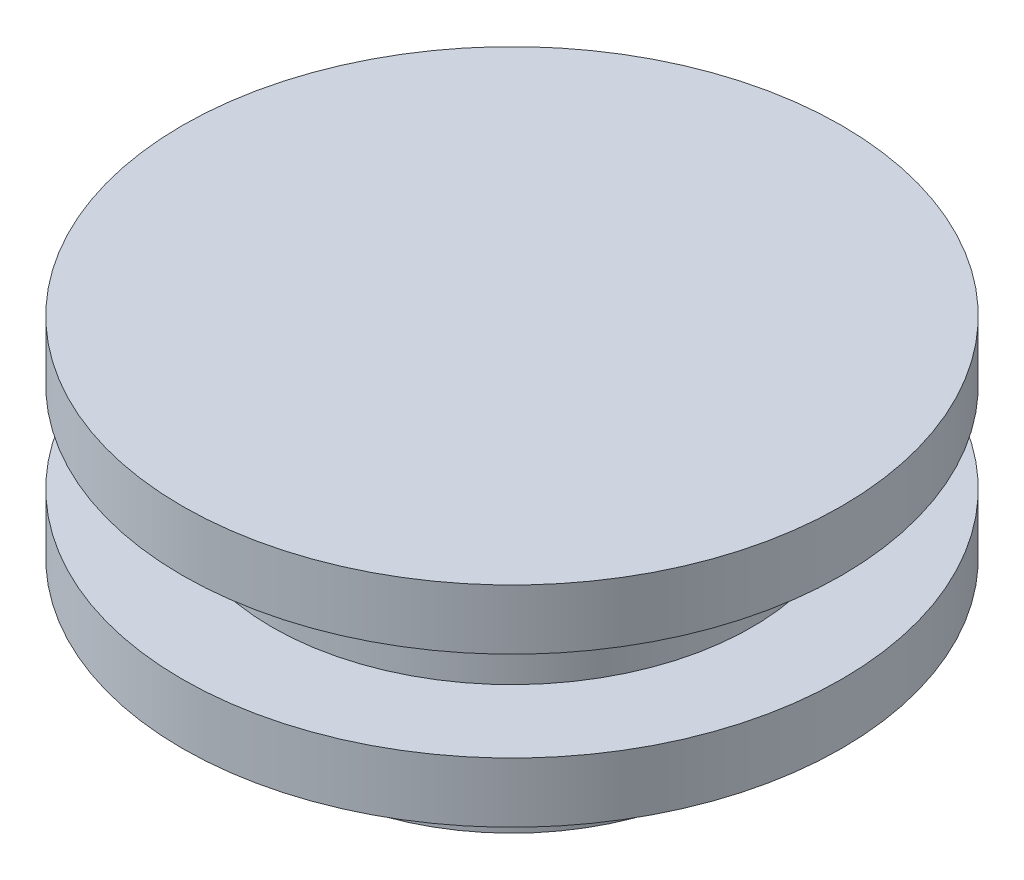
ISO-10303-21;
HEADER;
FILE_DESCRIPTION(('STEP AP214'),'2;1');
FILE_NAME('part.step','',(''),(''),'','','');
FILE_SCHEMA(('AUTOMOTIVE_DESIGN { 1 0 10303 214 1 1 1 1 }'));
ENDSEC;
DATA;
#1=APPLICATION_CONTEXT('core data for automotive mechanical design processes');
#2=APPLICATION_PROTOCOL_DEFINITION('international standard','automotive_design',2000,#1);
#3=PRODUCT_CONTEXT('',#1,'mechanical');
#4=PRODUCT('Part','Part','',(#3));
#5=PRODUCT_RELATED_PRODUCT_CATEGORY('part','',(#4));
#6=PRODUCT_DEFINITION_FORMATION('','',#4);
#7=PRODUCT_DEFINITION_CONTEXT('part definition',#1,'design');
#8=PRODUCT_DEFINITION('design','',#6,#7);
#9=PRODUCT_DEFINITION_SHAPE('','',#8);
#10=(LENGTH_UNIT() NAMED_UNIT(*) SI_UNIT(.MILLI.,.METRE.));
#11=(NAMED_UNIT(*) PLANE_ANGLE_UNIT() SI_UNIT($,.RADIAN.));
#12=(NAMED_UNIT(*) SI_UNIT($,.STERADIAN.) SOLID_ANGLE_UNIT());
#13=UNCERTAINTY_MEASURE_WITH_UNIT(LENGTH_MEASURE(1.E-05),#10,'distance_accuracy_value','');
#14=(GEOMETRIC_REPRESENTATION_CONTEXT(3) GLOBAL_UNCERTAINTY_ASSIGNED_CONTEXT((#13)) GLOBAL_UNIT_ASSIGNED_CONTEXT((#10,
#11,#12)) REPRESENTATION_CONTEXT('',''));
#15=CARTESIAN_POINT('',(0.,0.,0.));
#16=DIRECTION('',(0.,0.,1.));
#17=DIRECTION('',(1.,0.,0.));
#18=AXIS2_PLACEMENT_3D('',#15,#16,#17);
#19=CARTESIAN_POINT('',(3.5,-4.,0.));
#20=DIRECTION('',(0.,1.,0.));
#21=DIRECTION('',(0.,0.,1.));
#22=AXIS2_PLACEMENT_3D('',#19,#20,#21);
#23=PLANE('',#22);
#24=CARTESIAN_POINT('',(0.,-4.,0.));
#25=DIRECTION('',(0.,1.,0.));
#26=DIRECTION('',(0.,0.,1.));
#27=AXIS2_PLACEMENT_3D('',#24,#25,#26);
#28=CIRCLE('',#27,3.5);
#29=CARTESIAN_POINT('',(0.,-4.,3.5));
#30=VERTEX_POINT('',#29);
#31=EDGE_CURVE('E86',#30,#30,#28,.T.);
#32=ORIENTED_EDGE('',*,*,#31,.F.);
#33=EDGE_LOOP('',(#32));
#34=FACE_BOUND('',#33,.T.);
#35=CARTESIAN_POINT('',(0.,-4.,0.));
#36=DIRECTION('',(0.,1.,0.));
#37=DIRECTION('',(0.,0.,1.));
#38=AXIS2_PLACEMENT_3D('',#35,#36,#37);
#39=CIRCLE('',#38,2.5);
#40=CARTESIAN_POINT('',(0.,-4.,2.5));
#41=VERTEX_POINT('',#40);
#42=EDGE_CURVE('E10',#41,#41,#39,.T.);
#43=ORIENTED_EDGE('',*,*,#42,.T.);
#44=EDGE_LOOP('',(#43));
#45=FACE_BOUND('',#44,.T.);
#46=ADVANCED_FACE('F43',(#34,#45),#23,.F.);
#47=CARTESIAN_POINT('',(0.,5.1119654012494,0.));
#48=DIRECTION('',(0.,1.,0.));
#49=DIRECTION('',(0.,0.,1.));
#50=AXIS2_PLACEMENT_3D('',#47,#48,#49);
#51=CYLINDRICAL_SURFACE('',#50,2.5);
#52=ORIENTED_EDGE('',*,*,#42,.F.);
#53=EDGE_LOOP('',(#52));
#54=FACE_BOUND('',#53,.T.);
#55=CARTESIAN_POINT('',(0.,-0.999999999999999,0.));
#56=DIRECTION('',(0.,1.,0.));
#57=DIRECTION('',(0.,0.,1.));
#58=AXIS2_PLACEMENT_3D('',#55,#56,#57);
#59=CIRCLE('',#58,2.5);
#60=CARTESIAN_POINT('',(0.,-0.999999999999999,2.5));
#61=VERTEX_POINT('',#60);
#62=EDGE_CURVE('E50',#61,#61,#59,.T.);
#63=ORIENTED_EDGE('',*,*,#62,.T.);
#64=EDGE_LOOP('',(#63));
#65=FACE_BOUND('',#64,.T.);
#66=ADVANCED_FACE('F94',(#54,#65),#51,.F.);
#67=CARTESIAN_POINT('',(2.5,-1.,0.));
#68=DIRECTION('',(0.,1.,0.));
#69=DIRECTION('',(0.,0.,1.));
#70=AXIS2_PLACEMENT_3D('',#67,#68,#69);
#71=PLANE('',#70);
#72=ORIENTED_EDGE('',*,*,#62,.F.);
#73=EDGE_LOOP('',(#72));
#74=FACE_BOUND('',#73,.T.);
#75=ADVANCED_FACE('F98',(#74),#71,.F.);
#76=CARTESIAN_POINT('',(5.5,1.,0.));
#77=DIRECTION('',(0.,-1.,0.));
#78=DIRECTION('',(0.,0.,-1.));
#79=AXIS2_PLACEMENT_3D('',#76,#77,#78);
#80=PLANE('',#79);
#81=CARTESIAN_POINT('',(0.,1.,0.));
#82=DIRECTION('',(0.,1.,0.));
#83=DIRECTION('',(0.,0.,1.));
#84=AXIS2_PLACEMENT_3D('',#81,#82,#83);
#85=CIRCLE('',#84,5.5);
#86=CARTESIAN_POINT('',(0.,1.,5.5));
#87=VERTEX_POINT('',#86);
#88=EDGE_CURVE('E55',#87,#87,#85,.T.);
#89=ORIENTED_EDGE('',*,*,#88,.T.);
#90=EDGE_LOOP('',(#89));
#91=FACE_BOUND('',#90,.T.);
#92=ADVANCED_FACE('F103',(#91),#80,.F.);
#93=CARTESIAN_POINT('',(0.,5.1119654012494,0.));
#94=DIRECTION('',(0.,1.,0.));
#95=DIRECTION('',(0.,0.,1.));
#96=AXIS2_PLACEMENT_3D('',#93,#94,#95);
#97=CYLINDRICAL_SURFACE('',#96,5.5);
#98=ORIENTED_EDGE('',*,*,#88,.F.);
#99=EDGE_LOOP('',(#98));
#100=FACE_BOUND('',#99,.T.);
#101=CARTESIAN_POINT('',(0.,0.,0.));
#102=DIRECTION('',(0.,1.,0.));
#103=DIRECTION('',(0.,0.,1.));
#104=AXIS2_PLACEMENT_3D('',#101,#102,#103);
#105=CIRCLE('',#104,5.5);
#106=CARTESIAN_POINT('',(0.,0.,5.5));
#107=VERTEX_POINT('',#106);
#108=EDGE_CURVE('E60',#107,#107,#105,.T.);
#109=ORIENTED_EDGE('',*,*,#108,.T.);
#110=EDGE_LOOP('',(#109));
#111=FACE_BOUND('',#110,.T.);
#112=ADVANCED_FACE('F109',(#100,#111),#97,.T.);
#113=CARTESIAN_POINT('',(4.,0.,0.));
#114=DIRECTION('',(0.,1.,0.));
#115=DIRECTION('',(0.,0.,1.));
#116=AXIS2_PLACEMENT_3D('',#113,#114,#115);
#117=PLANE('',#116);
#118=ORIENTED_EDGE('',*,*,#108,.F.);
#119=EDGE_LOOP('',(#118));
#120=FACE_BOUND('',#119,.T.);
#121=CARTESIAN_POINT('',(0.,0.,0.));
#122=DIRECTION('',(0.,1.,0.));
#123=DIRECTION('',(0.,0.,1.));
#124=AXIS2_PLACEMENT_3D('',#121,#122,#123);
#125=CIRCLE('',#124,4.);
#126=CARTESIAN_POINT('',(0.,0.,4.));
#127=VERTEX_POINT('',#126);
#128=EDGE_CURVE('E66',#127,#127,#125,.T.);
#129=ORIENTED_EDGE('',*,*,#128,.T.);
#130=EDGE_LOOP('',(#129));
#131=FACE_BOUND('',#130,.T.);
#132=ADVANCED_FACE('F113',(#120,#131),#117,.F.);
#133=CARTESIAN_POINT('',(0.,5.1119654012494,0.));
#134=DIRECTION('',(0.,1.,0.));
#135=DIRECTION('',(0.,0.,1.));
#136=AXIS2_PLACEMENT_3D('',#133,#134,#135);
#137=CYLINDRICAL_SURFACE('',#136,4.);
#138=ORIENTED_EDGE('',*,*,#128,.F.);
#139=EDGE_LOOP('',(#138));
#140=FACE_BOUND('',#139,.T.);
#141=CARTESIAN_POINT('',(0.,-1.5,0.));
#142=DIRECTION('',(0.,1.,0.));
#143=DIRECTION('',(0.,0.,1.));
#144=AXIS2_PLACEMENT_3D('',#141,#142,#143);
#145=CIRCLE('',#144,4.);
#146=CARTESIAN_POINT('',(0.,-1.5,4.));
#147=VERTEX_POINT('',#146);
#148=EDGE_CURVE('E70',#147,#147,#145,.T.);
#149=ORIENTED_EDGE('',*,*,#148,.T.);
#150=EDGE_LOOP('',(#149));
#151=FACE_BOUND('',#150,.T.);
#152=ADVANCED_FACE('F117',(#140,#151),#137,.T.);
#153=CARTESIAN_POINT('',(5.5,-1.5,0.));
#154=DIRECTION('',(0.,-1.,0.));
#155=DIRECTION('',(0.,0.,-1.));
#156=AXIS2_PLACEMENT_3D('',#153,#154,#155);
#157=PLANE('',#156);
#158=ORIENTED_EDGE('',*,*,#148,.F.);
#159=EDGE_LOOP('',(#158));
#160=FACE_BOUND('',#159,.T.);
#161=CARTESIAN_POINT('',(0.,-1.5,0.));
#162=DIRECTION('',(0.,1.,0.));
#163=DIRECTION('',(0.,0.,1.));
#164=AXIS2_PLACEMENT_3D('',#161,#162,#163);
#165=CIRCLE('',#164,5.5);
#166=CARTESIAN_POINT('',(0.,-1.5,5.5));
#167=VERTEX_POINT('',#166);
#168=EDGE_CURVE('E74',#167,#167,#165,.T.);
#169=ORIENTED_EDGE('',*,*,#168,.T.);
#170=EDGE_LOOP('',(#169));
#171=FACE_BOUND('',#170,.T.);
#172=ADVANCED_FACE('F121',(#160,#171),#157,.F.);
#173=CARTESIAN_POINT('',(0.,5.1119654012494,0.));
#174=DIRECTION('',(0.,1.,0.));
#175=DIRECTION('',(0.,0.,1.));
#176=AXIS2_PLACEMENT_3D('',#173,#174,#175);
#177=CYLINDRICAL_SURFACE('',#176,5.5);
#178=ORIENTED_EDGE('',*,*,#168,.F.);
#179=EDGE_LOOP('',(#178));
#180=FACE_BOUND('',#179,.T.);
#181=CARTESIAN_POINT('',(0.,-2.5,0.));
#182=DIRECTION('',(0.,1.,0.));
#183=DIRECTION('',(0.,0.,1.));
#184=AXIS2_PLACEMENT_3D('',#181,#182,#183);
#185=CIRCLE('',#184,5.5);
#186=CARTESIAN_POINT('',(0.,-2.5,5.5));
#187=VERTEX_POINT('',#186);
#188=EDGE_CURVE('E78',#187,#187,#185,.T.);
#189=ORIENTED_EDGE('',*,*,#188,.T.);
#190=EDGE_LOOP('',(#189));
#191=FACE_BOUND('',#190,.T.);
#192=ADVANCED_FACE('F125',(#180,#191),#177,.T.);
#193=CARTESIAN_POINT('',(3.5,-2.5,0.));
#194=DIRECTION('',(0.,1.,0.));
#195=DIRECTION('',(0.,0.,1.));
#196=AXIS2_PLACEMENT_3D('',#193,#194,#195);
#197=PLANE('',#196);
#198=ORIENTED_EDGE('',*,*,#188,.F.);
#199=EDGE_LOOP('',(#198));
#200=FACE_BOUND('',#199,.T.);
#201=CARTESIAN_POINT('',(0.,-2.5,0.));
#202=DIRECTION('',(0.,1.,0.));
#203=DIRECTION('',(0.,0.,1.));
#204=AXIS2_PLACEMENT_3D('',#201,#202,#203);
#205=CIRCLE('',#204,3.5);
#206=CARTESIAN_POINT('',(0.,-2.5,3.5));
#207=VERTEX_POINT('',#206);
#208=EDGE_CURVE('E82',#207,#207,#205,.T.);
#209=ORIENTED_EDGE('',*,*,#208,.T.);
#210=EDGE_LOOP('',(#209));
#211=FACE_BOUND('',#210,.T.);
#212=ADVANCED_FACE('F129',(#200,#211),#197,.F.);
#213=CARTESIAN_POINT('',(0.,5.1119654012494,0.));
#214=DIRECTION('',(0.,1.,0.));
#215=DIRECTION('',(0.,0.,1.));
#216=AXIS2_PLACEMENT_3D('',#213,#214,#215);
#217=CYLINDRICAL_SURFACE('',#216,3.5);
#218=ORIENTED_EDGE('',*,*,#208,.F.);
#219=EDGE_LOOP('',(#218));
#220=FACE_BOUND('',#219,.T.);
#221=ORIENTED_EDGE('',*,*,#31,.T.);
#222=EDGE_LOOP('',(#221));
#223=FACE_BOUND('',#222,.T.);
#224=ADVANCED_FACE('F91',(#220,#223),#217,.T.);
#225=CLOSED_SHELL('',(#46,#66,#75,#92,#112,#132,#152,#172,#192,#212,#224));
#226=MANIFOLD_SOLID_BREP('B2',#225);
#227=ADVANCED_BREP_SHAPE_REPRESENTATION('',(#18,#226),#14);
#228=SHAPE_DEFINITION_REPRESENTATION(#9,#227);
ENDSEC;
END-ISO-10303-21;
